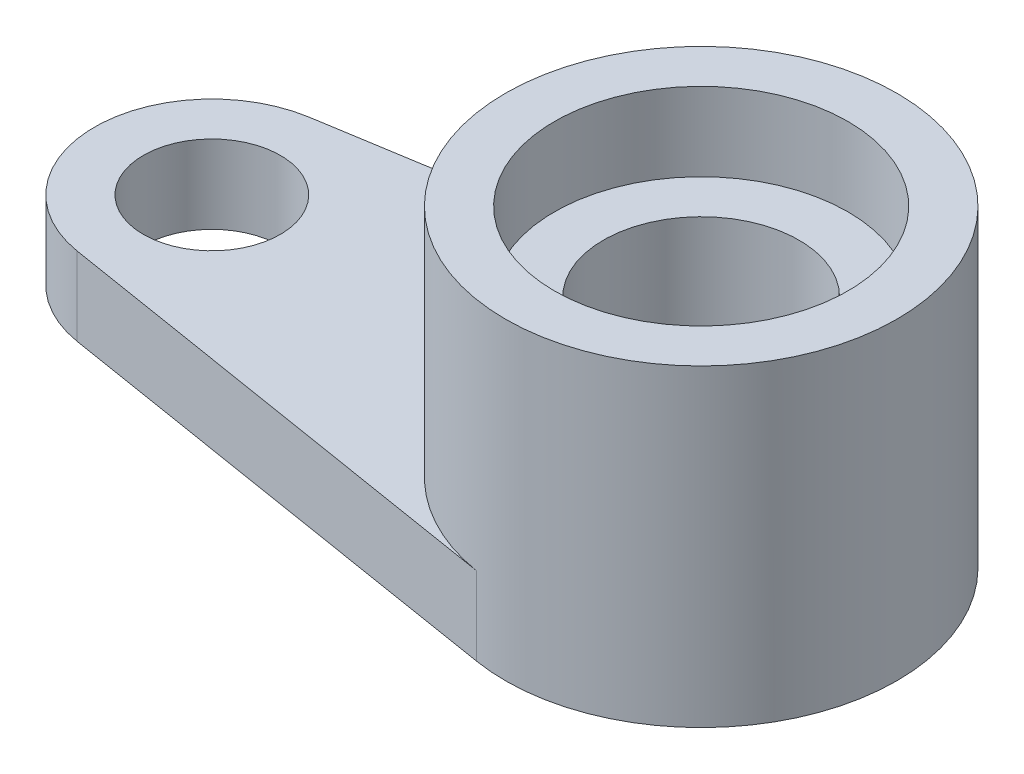
ISO-10303-21;
HEADER;
FILE_DESCRIPTION(('STEP AP214'),'2;1');
FILE_NAME('part.step','',(''),(''),'','','');
FILE_SCHEMA(('AUTOMOTIVE_DESIGN { 1 0 10303 214 1 1 1 1 }'));
ENDSEC;
DATA;
#1=APPLICATION_CONTEXT('core data for automotive mechanical design processes');
#2=APPLICATION_PROTOCOL_DEFINITION('international standard','automotive_design',2000,#1);
#3=PRODUCT_CONTEXT('',#1,'mechanical');
#4=PRODUCT('Part','Part','',(#3));
#5=PRODUCT_RELATED_PRODUCT_CATEGORY('part','',(#4));
#6=PRODUCT_DEFINITION_FORMATION('','',#4);
#7=PRODUCT_DEFINITION_CONTEXT('part definition',#1,'design');
#8=PRODUCT_DEFINITION('design','',#6,#7);
#9=PRODUCT_DEFINITION_SHAPE('','',#8);
#10=(LENGTH_UNIT() NAMED_UNIT(*) SI_UNIT(.MILLI.,.METRE.));
#11=(NAMED_UNIT(*) PLANE_ANGLE_UNIT() SI_UNIT($,.RADIAN.));
#12=(NAMED_UNIT(*) SI_UNIT($,.STERADIAN.) SOLID_ANGLE_UNIT());
#13=UNCERTAINTY_MEASURE_WITH_UNIT(LENGTH_MEASURE(1.E-05),#10,'distance_accuracy_value','');
#14=(GEOMETRIC_REPRESENTATION_CONTEXT(3) GLOBAL_UNCERTAINTY_ASSIGNED_CONTEXT((#13)) GLOBAL_UNIT_ASSIGNED_CONTEXT((#10,
#11,#12)) REPRESENTATION_CONTEXT('',''));
#15=CARTESIAN_POINT('',(0.,0.,0.));
#16=DIRECTION('',(0.,0.,1.));
#17=DIRECTION('',(1.,0.,0.));
#18=AXIS2_PLACEMENT_3D('',#15,#16,#17);
#19=CARTESIAN_POINT('',(0.,8.,0.));
#20=DIRECTION('',(0.,1.,0.));
#21=DIRECTION('',(0.,0.,1.));
#22=AXIS2_PLACEMENT_3D('',#19,#20,#21);
#23=PLANE('',#22);
#24=CARTESIAN_POINT('',(-50.,8.,0.));
#25=DIRECTION('',(0.,1.,0.));
#26=DIRECTION('',(0.,0.,1.));
#27=AXIS2_PLACEMENT_3D('',#24,#25,#26);
#28=CIRCLE('',#27,7.);
#29=CARTESIAN_POINT('',(-50.,8.,7.));
#30=VERTEX_POINT('',#29);
#31=EDGE_CURVE('E281',#30,#30,#28,.F.);
#32=ORIENTED_EDGE('',*,*,#31,.T.);
#33=EDGE_LOOP('',(#32));
#34=FACE_BOUND('',#33,.T.);
#35=DIRECTION('',(0.987117014340245,0.,0.16));
#36=VECTOR('',#35,1.);
#37=CARTESIAN_POINT('',(-3.2,8.,19.7423402868049));
#38=LINE('',#37,#36);
#39=CARTESIAN_POINT('',(-51.92,8.,11.8454041720829));
#40=VERTEX_POINT('',#39);
#41=CARTESIAN_POINT('',(-3.2,8.,19.7423402868049));
#42=VERTEX_POINT('',#41);
#43=EDGE_CURVE('E62',#40,#42,#38,.T.);
#44=ORIENTED_EDGE('',*,*,#43,.T.);
#45=CARTESIAN_POINT('',(0.,8.,0.));
#46=DIRECTION('',(0.,1.,0.));
#47=DIRECTION('',(0.,0.,1.));
#48=AXIS2_PLACEMENT_3D('',#45,#46,#47);
#49=CIRCLE('',#48,20.);
#50=CARTESIAN_POINT('',(-3.2,8.,-19.7423402868049));
#51=VERTEX_POINT('',#50);
#52=EDGE_CURVE('E100',#42,#51,#49,.F.);
#53=ORIENTED_EDGE('',*,*,#52,.T.);
#54=DIRECTION('',(0.987117014340245,0.,-0.16));
#55=VECTOR('',#54,1.);
#56=CARTESIAN_POINT('',(-3.2,8.,-19.7423402868049));
#57=LINE('',#56,#55);
#58=CARTESIAN_POINT('',(-51.92,8.,-11.8454041720829));
#59=VERTEX_POINT('',#58);
#60=EDGE_CURVE('E91',#59,#51,#57,.T.);
#61=ORIENTED_EDGE('',*,*,#60,.F.);
#62=CARTESIAN_POINT('',(-50.,8.,0.));
#63=DIRECTION('',(0.,1.,0.));
#64=DIRECTION('',(0.,0.,1.));
#65=AXIS2_PLACEMENT_3D('',#62,#63,#64);
#66=CIRCLE('',#65,12.);
#67=EDGE_CURVE('E93',#59,#40,#66,.T.);
#68=ORIENTED_EDGE('',*,*,#67,.T.);
#69=EDGE_LOOP('',(#44,#53,#61,#68));
#70=FACE_BOUND('',#69,.T.);
#71=ADVANCED_FACE('F43',(#34,#70),#23,.T.);
#72=CARTESIAN_POINT('',(-3.2,8.,-19.7423402868049));
#73=DIRECTION('',(-0.16,0.,-0.987117014340245));
#74=DIRECTION('',(-0.987117014340245,0.,0.16));
#75=AXIS2_PLACEMENT_3D('',#72,#73,#74);
#76=PLANE('',#75);
#77=DIRECTION('',(0.987117014340245,0.,-0.16));
#78=VECTOR('',#77,1.);
#79=CARTESIAN_POINT('',(-3.2,0.,-19.7423402868049));
#80=LINE('',#79,#78);
#81=CARTESIAN_POINT('',(-51.92,0.,-11.8454041720829));
#82=VERTEX_POINT('',#81);
#83=CARTESIAN_POINT('',(-3.2,0.,-19.7423402868049));
#84=VERTEX_POINT('',#83);
#85=EDGE_CURVE('E107',#82,#84,#80,.T.);
#86=ORIENTED_EDGE('',*,*,#85,.F.);
#87=DIRECTION('',(0.,-1.,0.));
#88=VECTOR('',#87,1.);
#89=CARTESIAN_POINT('',(-51.92,8.,-11.8454041720829));
#90=LINE('',#89,#88);
#91=EDGE_CURVE('E11',#59,#82,#90,.T.);
#92=ORIENTED_EDGE('',*,*,#91,.F.);
#93=ORIENTED_EDGE('',*,*,#60,.T.);
#94=DIRECTION('',(0.,-1.,0.));
#95=VECTOR('',#94,1.);
#96=CARTESIAN_POINT('',(-3.2,8.,-19.7423402868049));
#97=LINE('',#96,#95);
#98=EDGE_CURVE('E85',#51,#84,#97,.T.);
#99=ORIENTED_EDGE('',*,*,#98,.T.);
#100=EDGE_LOOP('',(#86,#92,#93,#99));
#101=FACE_BOUND('',#100,.T.);
#102=ADVANCED_FACE('F45',(#101),#76,.T.);
#103=CARTESIAN_POINT('',(-50.,8.,0.));
#104=DIRECTION('',(0.,-1.,0.));
#105=DIRECTION('',(0.,0.,-1.));
#106=AXIS2_PLACEMENT_3D('',#103,#104,#105);
#107=CYLINDRICAL_SURFACE('',#106,12.);
#108=CARTESIAN_POINT('',(-50.,0.,0.));
#109=DIRECTION('',(0.,1.,0.));
#110=DIRECTION('',(0.,0.,1.));
#111=AXIS2_PLACEMENT_3D('',#108,#109,#110);
#112=CIRCLE('',#111,12.);
#113=CARTESIAN_POINT('',(-51.92,0.,11.8454041720829));
#114=VERTEX_POINT('',#113);
#115=EDGE_CURVE('E114',#82,#114,#112,.T.);
#116=ORIENTED_EDGE('',*,*,#115,.T.);
#117=DIRECTION('',(0.,-1.,0.));
#118=VECTOR('',#117,1.);
#119=CARTESIAN_POINT('',(-51.92,8.,11.8454041720829));
#120=LINE('',#119,#118);
#121=EDGE_CURVE('E54',#40,#114,#120,.T.);
#122=ORIENTED_EDGE('',*,*,#121,.F.);
#123=ORIENTED_EDGE('',*,*,#67,.F.);
#124=ORIENTED_EDGE('',*,*,#91,.T.);
#125=EDGE_LOOP('',(#116,#122,#123,#124));
#126=FACE_BOUND('',#125,.T.);
#127=ADVANCED_FACE('F142',(#126),#107,.T.);
#128=CARTESIAN_POINT('',(-3.2,8.,19.7423402868049));
#129=DIRECTION('',(0.16,0.,-0.987117014340245));
#130=DIRECTION('',(-0.987117014340245,0.,-0.16));
#131=AXIS2_PLACEMENT_3D('',#128,#129,#130);
#132=PLANE('',#131);
#133=DIRECTION('',(0.987117014340245,0.,0.16));
#134=VECTOR('',#133,1.);
#135=CARTESIAN_POINT('',(-3.2,0.,19.7423402868049));
#136=LINE('',#135,#134);
#137=CARTESIAN_POINT('',(-3.2,0.,19.7423402868049));
#138=VERTEX_POINT('',#137);
#139=EDGE_CURVE('E78',#114,#138,#136,.T.);
#140=ORIENTED_EDGE('',*,*,#139,.T.);
#141=DIRECTION('',(0.,-1.,0.));
#142=VECTOR('',#141,1.);
#143=CARTESIAN_POINT('',(-3.2,8.,19.7423402868049));
#144=LINE('',#143,#142);
#145=EDGE_CURVE('E104',#42,#138,#144,.T.);
#146=ORIENTED_EDGE('',*,*,#145,.F.);
#147=ORIENTED_EDGE('',*,*,#43,.F.);
#148=ORIENTED_EDGE('',*,*,#121,.T.);
#149=EDGE_LOOP('',(#140,#146,#147,#148));
#150=FACE_BOUND('',#149,.T.);
#151=ADVANCED_FACE('F137',(#150),#132,.F.);
#152=CARTESIAN_POINT('',(0.,8.,0.));
#153=DIRECTION('',(0.,-1.,0.));
#154=DIRECTION('',(0.,0.,-1.));
#155=AXIS2_PLACEMENT_3D('',#152,#153,#154);
#156=CYLINDRICAL_SURFACE('',#155,20.);
#157=CARTESIAN_POINT('',(0.,0.,0.));
#158=DIRECTION('',(0.,1.,0.));
#159=DIRECTION('',(0.,0.,1.));
#160=AXIS2_PLACEMENT_3D('',#157,#158,#159);
#161=CIRCLE('',#160,20.);
#162=EDGE_CURVE('E94',#138,#84,#161,.T.);
#163=ORIENTED_EDGE('',*,*,#162,.T.);
#164=ORIENTED_EDGE('',*,*,#98,.F.);
#165=ORIENTED_EDGE('',*,*,#52,.F.);
#166=ORIENTED_EDGE('',*,*,#145,.T.);
#167=EDGE_LOOP('',(#163,#164,#165,#166));
#168=FACE_BOUND('',#167,.T.);
#169=CARTESIAN_POINT('',(0.,32.,0.));
#170=DIRECTION('',(0.,1.,0.));
#171=DIRECTION('',(0.,0.,1.));
#172=AXIS2_PLACEMENT_3D('',#169,#170,#171);
#173=CIRCLE('',#172,20.);
#174=CARTESIAN_POINT('',(0.,32.,20.));
#175=VERTEX_POINT('',#174);
#176=EDGE_CURVE('E108',#175,#175,#173,.T.);
#177=ORIENTED_EDGE('',*,*,#176,.F.);
#178=EDGE_LOOP('',(#177));
#179=FACE_BOUND('',#178,.T.);
#180=ADVANCED_FACE('F98',(#168,#179),#156,.T.);
#181=CARTESIAN_POINT('',(0.,0.,0.));
#182=DIRECTION('',(0.,1.,0.));
#183=DIRECTION('',(0.,0.,1.));
#184=AXIS2_PLACEMENT_3D('',#181,#182,#183);
#185=PLANE('',#184);
#186=CARTESIAN_POINT('',(-50.,0.,0.));
#187=DIRECTION('',(0.,1.,0.));
#188=DIRECTION('',(0.,0.,1.));
#189=AXIS2_PLACEMENT_3D('',#186,#187,#188);
#190=CIRCLE('',#189,7.);
#191=CARTESIAN_POINT('',(-50.,0.,7.));
#192=VERTEX_POINT('',#191);
#193=EDGE_CURVE('E284',#192,#192,#190,.T.);
#194=ORIENTED_EDGE('',*,*,#193,.T.);
#195=EDGE_LOOP('',(#194));
#196=FACE_BOUND('',#195,.T.);
#197=CARTESIAN_POINT('',(0.,0.,0.));
#198=DIRECTION('',(0.,1.,0.));
#199=DIRECTION('',(0.,0.,1.));
#200=AXIS2_PLACEMENT_3D('',#197,#198,#199);
#201=CIRCLE('',#200,10.);
#202=CARTESIAN_POINT('',(0.,0.,10.));
#203=VERTEX_POINT('',#202);
#204=EDGE_CURVE('E290',#203,#203,#201,.T.);
#205=ORIENTED_EDGE('',*,*,#204,.T.);
#206=EDGE_LOOP('',(#205));
#207=FACE_BOUND('',#206,.T.);
#208=ORIENTED_EDGE('',*,*,#162,.F.);
#209=ORIENTED_EDGE('',*,*,#139,.F.);
#210=ORIENTED_EDGE('',*,*,#115,.F.);
#211=ORIENTED_EDGE('',*,*,#85,.T.);
#212=EDGE_LOOP('',(#208,#209,#210,#211));
#213=FACE_BOUND('',#212,.T.);
#214=ADVANCED_FACE('F141',(#196,#207,#213),#185,.F.);
#215=CARTESIAN_POINT('',(0.,32.,0.));
#216=DIRECTION('',(0.,1.,0.));
#217=DIRECTION('',(0.,0.,1.));
#218=AXIS2_PLACEMENT_3D('',#215,#216,#217);
#219=PLANE('',#218);
#220=CARTESIAN_POINT('',(0.,32.,0.));
#221=DIRECTION('',(0.,1.,0.));
#222=DIRECTION('',(0.,0.,1.));
#223=AXIS2_PLACEMENT_3D('',#220,#221,#222);
#224=CIRCLE('',#223,15.);
#225=CARTESIAN_POINT('',(0.,32.,15.));
#226=VERTEX_POINT('',#225);
#227=EDGE_CURVE('E298',#226,#226,#224,.T.);
#228=ORIENTED_EDGE('',*,*,#227,.F.);
#229=EDGE_LOOP('',(#228));
#230=FACE_BOUND('',#229,.T.);
#231=ORIENTED_EDGE('',*,*,#176,.T.);
#232=EDGE_LOOP('',(#231));
#233=FACE_BOUND('',#232,.T.);
#234=ADVANCED_FACE('F157',(#230,#233),#219,.T.);
#235=CARTESIAN_POINT('',(0.,24.,0.));
#236=DIRECTION('',(0.,1.,0.));
#237=DIRECTION('',(0.,0.,1.));
#238=AXIS2_PLACEMENT_3D('',#235,#236,#237);
#239=CYLINDRICAL_SURFACE('',#238,15.);
#240=CARTESIAN_POINT('',(0.,24.,0.));
#241=DIRECTION('',(0.,1.,0.));
#242=DIRECTION('',(0.,0.,1.));
#243=AXIS2_PLACEMENT_3D('',#240,#241,#242);
#244=CIRCLE('',#243,15.);
#245=CARTESIAN_POINT('',(0.,24.,15.));
#246=VERTEX_POINT('',#245);
#247=EDGE_CURVE('E117',#246,#246,#244,.T.);
#248=ORIENTED_EDGE('',*,*,#247,.F.);
#249=EDGE_LOOP('',(#248));
#250=FACE_BOUND('',#249,.T.);
#251=ORIENTED_EDGE('',*,*,#227,.T.);
#252=EDGE_LOOP('',(#251));
#253=FACE_BOUND('',#252,.T.);
#254=ADVANCED_FACE('F177',(#250,#253),#239,.F.);
#255=CARTESIAN_POINT('',(0.,24.,0.));
#256=DIRECTION('',(0.,1.,0.));
#257=DIRECTION('',(0.,0.,1.));
#258=AXIS2_PLACEMENT_3D('',#255,#256,#257);
#259=PLANE('',#258);
#260=CARTESIAN_POINT('',(0.,24.,0.));
#261=DIRECTION('',(0.,1.,0.));
#262=DIRECTION('',(0.,0.,1.));
#263=AXIS2_PLACEMENT_3D('',#260,#261,#262);
#264=CIRCLE('',#263,10.);
#265=CARTESIAN_POINT('',(0.,24.,10.));
#266=VERTEX_POINT('',#265);
#267=EDGE_CURVE('E47',#266,#266,#264,.F.);
#268=ORIENTED_EDGE('',*,*,#267,.T.);
#269=EDGE_LOOP('',(#268));
#270=FACE_BOUND('',#269,.T.);
#271=ORIENTED_EDGE('',*,*,#247,.T.);
#272=EDGE_LOOP('',(#271));
#273=FACE_BOUND('',#272,.T.);
#274=ADVANCED_FACE('F184',(#270,#273),#259,.T.);
#275=CARTESIAN_POINT('',(0.,38.,0.));
#276=DIRECTION('',(0.,-1.,0.));
#277=DIRECTION('',(0.,0.,-1.));
#278=AXIS2_PLACEMENT_3D('',#275,#276,#277);
#279=CYLINDRICAL_SURFACE('',#278,10.);
#280=ORIENTED_EDGE('',*,*,#267,.F.);
#281=EDGE_LOOP('',(#280));
#282=FACE_BOUND('',#281,.T.);
#283=ORIENTED_EDGE('',*,*,#204,.F.);
#284=EDGE_LOOP('',(#283));
#285=FACE_BOUND('',#284,.T.);
#286=ADVANCED_FACE('F191',(#282,#285),#279,.F.);
#287=CARTESIAN_POINT('',(-50.,18.,0.));
#288=DIRECTION('',(0.,-1.,0.));
#289=DIRECTION('',(0.,0.,-1.));
#290=AXIS2_PLACEMENT_3D('',#287,#288,#289);
#291=CYLINDRICAL_SURFACE('',#290,7.);
#292=ORIENTED_EDGE('',*,*,#31,.F.);
#293=EDGE_LOOP('',(#292));
#294=FACE_BOUND('',#293,.T.);
#295=ORIENTED_EDGE('',*,*,#193,.F.);
#296=EDGE_LOOP('',(#295));
#297=FACE_BOUND('',#296,.T.);
#298=ADVANCED_FACE('F199',(#294,#297),#291,.F.);
#299=CLOSED_SHELL('',(#71,#102,#127,#151,#180,#214,#234,#254,#274,#286,#298));
#300=MANIFOLD_SOLID_BREP('B2',#299);
#301=ADVANCED_BREP_SHAPE_REPRESENTATION('',(#18,#300),#14);
#302=SHAPE_DEFINITION_REPRESENTATION(#9,#301);
ENDSEC;
END-ISO-10303-21;
